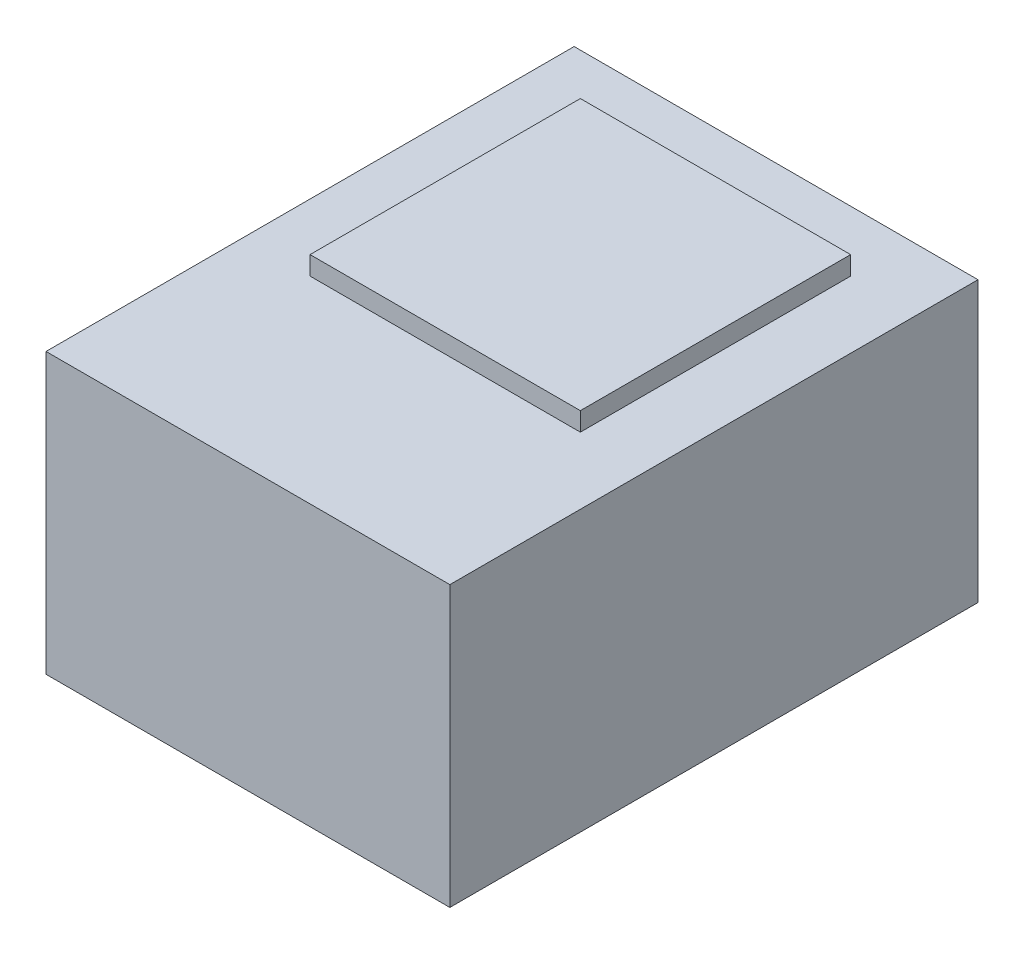
ISO-10303-21;
HEADER;
FILE_DESCRIPTION(('STEP AP214'),'2;1');
FILE_NAME('part.step','',(''),(''),'','','');
FILE_SCHEMA(('AUTOMOTIVE_DESIGN { 1 0 10303 214 1 1 1 1 }'));
ENDSEC;
DATA;
#1=APPLICATION_CONTEXT('core data for automotive mechanical design processes');
#2=APPLICATION_PROTOCOL_DEFINITION('international standard','automotive_design',2000,#1);
#3=PRODUCT_CONTEXT('',#1,'mechanical');
#4=PRODUCT('Part','Part','',(#3));
#5=PRODUCT_RELATED_PRODUCT_CATEGORY('part','',(#4));
#6=PRODUCT_DEFINITION_FORMATION('','',#4);
#7=PRODUCT_DEFINITION_CONTEXT('part definition',#1,'design');
#8=PRODUCT_DEFINITION('design','',#6,#7);
#9=PRODUCT_DEFINITION_SHAPE('','',#8);
#10=(LENGTH_UNIT() NAMED_UNIT(*) SI_UNIT(.MILLI.,.METRE.));
#11=(NAMED_UNIT(*) PLANE_ANGLE_UNIT() SI_UNIT($,.RADIAN.));
#12=(NAMED_UNIT(*) SI_UNIT($,.STERADIAN.) SOLID_ANGLE_UNIT());
#13=UNCERTAINTY_MEASURE_WITH_UNIT(LENGTH_MEASURE(1.E-05),#10,'distance_accuracy_value','');
#14=(GEOMETRIC_REPRESENTATION_CONTEXT(3) GLOBAL_UNCERTAINTY_ASSIGNED_CONTEXT((#13)) GLOBAL_UNIT_ASSIGNED_CONTEXT((#10,
#11,#12)) REPRESENTATION_CONTEXT('',''));
#15=CARTESIAN_POINT('',(0.,0.,0.));
#16=DIRECTION('',(0.,0.,1.));
#17=DIRECTION('',(1.,0.,0.));
#18=AXIS2_PLACEMENT_3D('',#15,#16,#17);
#19=CARTESIAN_POINT('',(0.,0.,0.));
#20=DIRECTION('',(0.,1.,0.));
#21=DIRECTION('',(0.,0.,1.));
#22=AXIS2_PLACEMENT_3D('',#19,#20,#21);
#23=PLANE('',#22);
#24=DIRECTION('',(0.,0.,1.));
#25=VECTOR('',#24,1.);
#26=CARTESIAN_POINT('',(-0.125,0.,0.786372602362917));
#27=LINE('',#26,#25);
#28=CARTESIAN_POINT('',(-0.124999999999999,0.,-0.713627397637083));
#29=VERTEX_POINT('',#28);
#30=CARTESIAN_POINT('',(-0.125,0.,0.786372602362917));
#31=VERTEX_POINT('',#30);
#32=EDGE_CURVE('E216',#29,#31,#27,.T.);
#33=ORIENTED_EDGE('',*,*,#32,.F.);
#34=DIRECTION('',(1.,0.,0.));
#35=VECTOR('',#34,1.);
#36=CARTESIAN_POINT('',(-0.524999999999999,0.,-0.713627397637083));
#37=LINE('',#36,#35);
#38=CARTESIAN_POINT('',(-0.524999999999999,0.,-0.713627397637083));
#39=VERTEX_POINT('',#38);
#40=EDGE_CURVE('E221',#39,#29,#37,.T.);
#41=ORIENTED_EDGE('',*,*,#40,.F.);
#42=DIRECTION('',(0.,0.,-1.));
#43=VECTOR('',#42,1.);
#44=CARTESIAN_POINT('',(-0.525,0.,0.786372602362917));
#45=LINE('',#44,#43);
#46=CARTESIAN_POINT('',(-0.525,0.,0.786372602362917));
#47=VERTEX_POINT('',#46);
#48=EDGE_CURVE('E233',#47,#39,#45,.T.);
#49=ORIENTED_EDGE('',*,*,#48,.F.);
#50=DIRECTION('',(-1.,0.,0.));
#51=VECTOR('',#50,1.);
#52=CARTESIAN_POINT('',(-0.525,0.,0.786372602362917));
#53=LINE('',#52,#51);
#54=EDGE_CURVE('E230',#31,#47,#53,.T.);
#55=ORIENTED_EDGE('',*,*,#54,.F.);
#56=EDGE_LOOP('',(#33,#41,#49,#55));
#57=FACE_BOUND('',#56,.T.);
#58=DIRECTION('',(0.,0.,-1.));
#59=VECTOR('',#58,1.);
#60=CARTESIAN_POINT('',(0.65,0.,-0.85));
#61=LINE('',#60,#59);
#62=CARTESIAN_POINT('',(0.65,0.,0.85));
#63=VERTEX_POINT('',#62);
#64=CARTESIAN_POINT('',(0.65,0.,-0.85));
#65=VERTEX_POINT('',#64);
#66=EDGE_CURVE('E249',#63,#65,#61,.T.);
#67=ORIENTED_EDGE('',*,*,#66,.F.);
#68=DIRECTION('',(1.,0.,0.));
#69=VECTOR('',#68,1.);
#70=CARTESIAN_POINT('',(-0.65,0.,0.85));
#71=LINE('',#70,#69);
#72=CARTESIAN_POINT('',(-0.65,0.,0.85));
#73=VERTEX_POINT('',#72);
#74=EDGE_CURVE('E254',#73,#63,#71,.T.);
#75=ORIENTED_EDGE('',*,*,#74,.F.);
#76=DIRECTION('',(0.,0.,1.));
#77=VECTOR('',#76,1.);
#78=CARTESIAN_POINT('',(-0.65,0.,-0.85));
#79=LINE('',#78,#77);
#80=CARTESIAN_POINT('',(-0.65,0.,-0.85));
#81=VERTEX_POINT('',#80);
#82=EDGE_CURVE('E265',#81,#73,#79,.T.);
#83=ORIENTED_EDGE('',*,*,#82,.F.);
#84=DIRECTION('',(-1.,0.,0.));
#85=VECTOR('',#84,1.);
#86=CARTESIAN_POINT('',(-0.65,0.,-0.85));
#87=LINE('',#86,#85);
#88=EDGE_CURVE('E263',#65,#81,#87,.T.);
#89=ORIENTED_EDGE('',*,*,#88,.F.);
#90=EDGE_LOOP('',(#67,#75,#83,#89));
#91=FACE_BOUND('',#90,.T.);
#92=DIRECTION('',(0.,0.,1.));
#93=VECTOR('',#92,1.);
#94=CARTESIAN_POINT('',(0.525,0.,0.786372602362917));
#95=LINE('',#94,#93);
#96=CARTESIAN_POINT('',(0.525,0.,-0.713627397637083));
#97=VERTEX_POINT('',#96);
#98=CARTESIAN_POINT('',(0.525,0.,0.786372602362917));
#99=VERTEX_POINT('',#98);
#100=EDGE_CURVE('E179',#97,#99,#95,.T.);
#101=ORIENTED_EDGE('',*,*,#100,.F.);
#102=DIRECTION('',(1.,0.,0.));
#103=VECTOR('',#102,1.);
#104=CARTESIAN_POINT('',(0.125000000000001,0.,-0.713627397637083));
#105=LINE('',#104,#103);
#106=CARTESIAN_POINT('',(0.125000000000001,0.,-0.713627397637083));
#107=VERTEX_POINT('',#106);
#108=EDGE_CURVE('E188',#107,#97,#105,.T.);
#109=ORIENTED_EDGE('',*,*,#108,.F.);
#110=DIRECTION('',(0.,0.,-1.));
#111=VECTOR('',#110,1.);
#112=CARTESIAN_POINT('',(0.125,0.,0.786372602362917));
#113=LINE('',#112,#111);
#114=CARTESIAN_POINT('',(0.125,0.,0.786372602362917));
#115=VERTEX_POINT('',#114);
#116=EDGE_CURVE('E200',#115,#107,#113,.T.);
#117=ORIENTED_EDGE('',*,*,#116,.F.);
#118=DIRECTION('',(-1.,0.,0.));
#119=VECTOR('',#118,1.);
#120=CARTESIAN_POINT('',(0.125,0.,0.786372602362917));
#121=LINE('',#120,#119);
#122=EDGE_CURVE('E197',#99,#115,#121,.T.);
#123=ORIENTED_EDGE('',*,*,#122,.F.);
#124=EDGE_LOOP('',(#101,#109,#117,#123));
#125=FACE_BOUND('',#124,.T.);
#126=ADVANCED_FACE('F34',(#57,#91,#125),#23,.F.);
#127=CARTESIAN_POINT('',(0.65,0.9,-0.85));
#128=DIRECTION('',(-1.,0.,0.));
#129=DIRECTION('',(0.,0.,1.));
#130=AXIS2_PLACEMENT_3D('',#127,#128,#129);
#131=PLANE('',#130);
#132=ORIENTED_EDGE('',*,*,#66,.T.);
#133=DIRECTION('',(0.,-1.,0.));
#134=VECTOR('',#133,1.);
#135=CARTESIAN_POINT('',(0.65,0.9,-0.85));
#136=LINE('',#135,#134);
#137=CARTESIAN_POINT('',(0.65,0.9,-0.85));
#138=VERTEX_POINT('',#137);
#139=EDGE_CURVE('E11',#138,#65,#136,.T.);
#140=ORIENTED_EDGE('',*,*,#139,.F.);
#141=DIRECTION('',(0.,0.,-1.));
#142=VECTOR('',#141,1.);
#143=CARTESIAN_POINT('',(0.65,0.9,-0.85));
#144=LINE('',#143,#142);
#145=CARTESIAN_POINT('',(0.65,0.9,0.85));
#146=VERTEX_POINT('',#145);
#147=EDGE_CURVE('E250',#146,#138,#144,.T.);
#148=ORIENTED_EDGE('',*,*,#147,.F.);
#149=DIRECTION('',(0.,-1.,0.));
#150=VECTOR('',#149,1.);
#151=CARTESIAN_POINT('',(0.65,0.9,0.85));
#152=LINE('',#151,#150);
#153=EDGE_CURVE('E260',#146,#63,#152,.T.);
#154=ORIENTED_EDGE('',*,*,#153,.T.);
#155=EDGE_LOOP('',(#132,#140,#148,#154));
#156=FACE_BOUND('',#155,.T.);
#157=ADVANCED_FACE('F36',(#156),#131,.F.);
#158=CARTESIAN_POINT('',(-0.65,0.9,-0.85));
#159=DIRECTION('',(0.,0.,1.));
#160=DIRECTION('',(1.,0.,0.));
#161=AXIS2_PLACEMENT_3D('',#158,#159,#160);
#162=PLANE('',#161);
#163=ORIENTED_EDGE('',*,*,#88,.T.);
#164=DIRECTION('',(0.,-1.,0.));
#165=VECTOR('',#164,1.);
#166=CARTESIAN_POINT('',(-0.65,0.9,-0.85));
#167=LINE('',#166,#165);
#168=CARTESIAN_POINT('',(-0.65,0.9,-0.85));
#169=VERTEX_POINT('',#168);
#170=EDGE_CURVE('E42',#169,#81,#167,.T.);
#171=ORIENTED_EDGE('',*,*,#170,.F.);
#172=DIRECTION('',(-1.,0.,0.));
#173=VECTOR('',#172,1.);
#174=CARTESIAN_POINT('',(-0.65,0.9,-0.85));
#175=LINE('',#174,#173);
#176=EDGE_CURVE('E253',#138,#169,#175,.T.);
#177=ORIENTED_EDGE('',*,*,#176,.F.);
#178=ORIENTED_EDGE('',*,*,#139,.T.);
#179=EDGE_LOOP('',(#163,#171,#177,#178));
#180=FACE_BOUND('',#179,.T.);
#181=ADVANCED_FACE('F293',(#180),#162,.F.);
#182=CARTESIAN_POINT('',(-0.65,0.9,-0.85));
#183=DIRECTION('',(1.,0.,0.));
#184=DIRECTION('',(0.,0.,-1.));
#185=AXIS2_PLACEMENT_3D('',#182,#183,#184);
#186=PLANE('',#185);
#187=ORIENTED_EDGE('',*,*,#82,.T.);
#188=DIRECTION('',(0.,-1.,0.));
#189=VECTOR('',#188,1.);
#190=CARTESIAN_POINT('',(-0.65,0.9,0.85));
#191=LINE('',#190,#189);
#192=CARTESIAN_POINT('',(-0.65,0.9,0.85));
#193=VERTEX_POINT('',#192);
#194=EDGE_CURVE('E270',#193,#73,#191,.T.);
#195=ORIENTED_EDGE('',*,*,#194,.F.);
#196=DIRECTION('',(0.,0.,1.));
#197=VECTOR('',#196,1.);
#198=CARTESIAN_POINT('',(-0.65,0.9,-0.85));
#199=LINE('',#198,#197);
#200=EDGE_CURVE('E256',#169,#193,#199,.T.);
#201=ORIENTED_EDGE('',*,*,#200,.F.);
#202=ORIENTED_EDGE('',*,*,#170,.T.);
#203=EDGE_LOOP('',(#187,#195,#201,#202));
#204=FACE_BOUND('',#203,.T.);
#205=ADVANCED_FACE('F277',(#204),#186,.F.);
#206=CARTESIAN_POINT('',(-0.65,0.9,0.85));
#207=DIRECTION('',(0.,0.,-1.));
#208=DIRECTION('',(-1.,0.,0.));
#209=AXIS2_PLACEMENT_3D('',#206,#207,#208);
#210=PLANE('',#209);
#211=ORIENTED_EDGE('',*,*,#74,.T.);
#212=ORIENTED_EDGE('',*,*,#153,.F.);
#213=DIRECTION('',(1.,0.,0.));
#214=VECTOR('',#213,1.);
#215=CARTESIAN_POINT('',(-0.65,0.9,0.85));
#216=LINE('',#215,#214);
#217=EDGE_CURVE('E258',#193,#146,#216,.T.);
#218=ORIENTED_EDGE('',*,*,#217,.F.);
#219=ORIENTED_EDGE('',*,*,#194,.T.);
#220=EDGE_LOOP('',(#211,#212,#218,#219));
#221=FACE_BOUND('',#220,.T.);
#222=ADVANCED_FACE('F286',(#221),#210,.F.);
#223=CARTESIAN_POINT('',(0.,0.9,0.));
#224=DIRECTION('',(0.,1.,0.));
#225=DIRECTION('',(0.,0.,1.));
#226=AXIS2_PLACEMENT_3D('',#223,#224,#225);
#227=PLANE('',#226);
#228=DIRECTION('',(1.,0.,0.));
#229=VECTOR('',#228,1.);
#230=CARTESIAN_POINT('',(-0.435,0.9,-0.655));
#231=LINE('',#230,#229);
#232=CARTESIAN_POINT('',(-0.435,0.9,-0.655));
#233=VERTEX_POINT('',#232);
#234=CARTESIAN_POINT('',(0.435,0.9,-0.655));
#235=VERTEX_POINT('',#234);
#236=EDGE_CURVE('E174',#233,#235,#231,.T.);
#237=ORIENTED_EDGE('',*,*,#236,.T.);
#238=DIRECTION('',(0.,0.,1.));
#239=VECTOR('',#238,1.);
#240=CARTESIAN_POINT('',(0.435,0.9,-0.655));
#241=LINE('',#240,#239);
#242=CARTESIAN_POINT('',(0.435,0.9,0.215));
#243=VERTEX_POINT('',#242);
#244=EDGE_CURVE('E151',#235,#243,#241,.T.);
#245=ORIENTED_EDGE('',*,*,#244,.T.);
#246=DIRECTION('',(1.,0.,0.));
#247=VECTOR('',#246,1.);
#248=CARTESIAN_POINT('',(-0.435,0.9,0.215));
#249=LINE('',#248,#247);
#250=CARTESIAN_POINT('',(-0.435,0.9,0.215));
#251=VERTEX_POINT('',#250);
#252=EDGE_CURVE('E54',#251,#243,#249,.T.);
#253=ORIENTED_EDGE('',*,*,#252,.F.);
#254=DIRECTION('',(0.,0.,1.));
#255=VECTOR('',#254,1.);
#256=CARTESIAN_POINT('',(-0.435,0.9,-0.655));
#257=LINE('',#256,#255);
#258=EDGE_CURVE('E49',#233,#251,#257,.T.);
#259=ORIENTED_EDGE('',*,*,#258,.F.);
#260=EDGE_LOOP('',(#237,#245,#253,#259));
#261=FACE_BOUND('',#260,.T.);
#262=ORIENTED_EDGE('',*,*,#147,.T.);
#263=ORIENTED_EDGE('',*,*,#176,.T.);
#264=ORIENTED_EDGE('',*,*,#200,.T.);
#265=ORIENTED_EDGE('',*,*,#217,.T.);
#266=EDGE_LOOP('',(#262,#263,#264,#265));
#267=FACE_BOUND('',#266,.T.);
#268=ADVANCED_FACE('F292',(#261,#267),#227,.T.);
#269=CARTESIAN_POINT('',(-0.125,-0.06,0.786372602362917));
#270=DIRECTION('',(-1.,0.,0.));
#271=DIRECTION('',(0.,0.,1.));
#272=AXIS2_PLACEMENT_3D('',#269,#270,#271);
#273=PLANE('',#272);
#274=ORIENTED_EDGE('',*,*,#32,.T.);
#275=DIRECTION('',(0.,1.,0.));
#276=VECTOR('',#275,1.);
#277=CARTESIAN_POINT('',(-0.125,-0.06,0.786372602362917));
#278=LINE('',#277,#276);
#279=CARTESIAN_POINT('',(-0.125,-0.06,0.786372602362917));
#280=VERTEX_POINT('',#279);
#281=EDGE_CURVE('E246',#280,#31,#278,.T.);
#282=ORIENTED_EDGE('',*,*,#281,.F.);
#283=DIRECTION('',(0.,0.,1.));
#284=VECTOR('',#283,1.);
#285=CARTESIAN_POINT('',(-0.125,-0.06,0.786372602362917));
#286=LINE('',#285,#284);
#287=CARTESIAN_POINT('',(-0.124999999999999,-0.06,-0.713627397637083));
#288=VERTEX_POINT('',#287);
#289=EDGE_CURVE('E217',#288,#280,#286,.T.);
#290=ORIENTED_EDGE('',*,*,#289,.F.);
#291=DIRECTION('',(0.,1.,0.));
#292=VECTOR('',#291,1.);
#293=CARTESIAN_POINT('',(-0.124999999999999,-0.06,-0.713627397637083));
#294=LINE('',#293,#292);
#295=EDGE_CURVE('E227',#288,#29,#294,.T.);
#296=ORIENTED_EDGE('',*,*,#295,.T.);
#297=EDGE_LOOP('',(#274,#282,#290,#296));
#298=FACE_BOUND('',#297,.T.);
#299=ADVANCED_FACE('F312',(#298),#273,.F.);
#300=CARTESIAN_POINT('',(-0.525,-0.06,0.786372602362917));
#301=DIRECTION('',(0.,0.,-1.));
#302=DIRECTION('',(-1.,0.,0.));
#303=AXIS2_PLACEMENT_3D('',#300,#301,#302);
#304=PLANE('',#303);
#305=ORIENTED_EDGE('',*,*,#54,.T.);
#306=DIRECTION('',(0.,1.,0.));
#307=VECTOR('',#306,1.);
#308=CARTESIAN_POINT('',(-0.525,-0.06,0.786372602362917));
#309=LINE('',#308,#307);
#310=CARTESIAN_POINT('',(-0.525,-0.06,0.786372602362917));
#311=VERTEX_POINT('',#310);
#312=EDGE_CURVE('E243',#311,#47,#309,.T.);
#313=ORIENTED_EDGE('',*,*,#312,.F.);
#314=DIRECTION('',(-1.,0.,0.));
#315=VECTOR('',#314,1.);
#316=CARTESIAN_POINT('',(-0.525,-0.06,0.786372602362917));
#317=LINE('',#316,#315);
#318=EDGE_CURVE('E220',#280,#311,#317,.T.);
#319=ORIENTED_EDGE('',*,*,#318,.F.);
#320=ORIENTED_EDGE('',*,*,#281,.T.);
#321=EDGE_LOOP('',(#305,#313,#319,#320));
#322=FACE_BOUND('',#321,.T.);
#323=ADVANCED_FACE('F316',(#322),#304,.F.);
#324=CARTESIAN_POINT('',(-0.525,-0.06,0.786372602362917));
#325=DIRECTION('',(1.,0.,0.));
#326=DIRECTION('',(0.,0.,-1.));
#327=AXIS2_PLACEMENT_3D('',#324,#325,#326);
#328=PLANE('',#327);
#329=ORIENTED_EDGE('',*,*,#48,.T.);
#330=DIRECTION('',(0.,1.,0.));
#331=VECTOR('',#330,1.);
#332=CARTESIAN_POINT('',(-0.524999999999999,-0.06,-0.713627397637083));
#333=LINE('',#332,#331);
#334=CARTESIAN_POINT('',(-0.524999999999999,-0.06,-0.713627397637083));
#335=VERTEX_POINT('',#334);
#336=EDGE_CURVE('E240',#335,#39,#333,.T.);
#337=ORIENTED_EDGE('',*,*,#336,.F.);
#338=DIRECTION('',(0.,0.,-1.));
#339=VECTOR('',#338,1.);
#340=CARTESIAN_POINT('',(-0.525,-0.06,0.786372602362917));
#341=LINE('',#340,#339);
#342=EDGE_CURVE('E223',#311,#335,#341,.T.);
#343=ORIENTED_EDGE('',*,*,#342,.F.);
#344=ORIENTED_EDGE('',*,*,#312,.T.);
#345=EDGE_LOOP('',(#329,#337,#343,#344));
#346=FACE_BOUND('',#345,.T.);
#347=ADVANCED_FACE('F362',(#346),#328,.F.);
#348=CARTESIAN_POINT('',(-0.524999999999999,-0.06,-0.713627397637083));
#349=DIRECTION('',(0.,0.,1.));
#350=DIRECTION('',(1.,0.,0.));
#351=AXIS2_PLACEMENT_3D('',#348,#349,#350);
#352=PLANE('',#351);
#353=ORIENTED_EDGE('',*,*,#40,.T.);
#354=ORIENTED_EDGE('',*,*,#295,.F.);
#355=DIRECTION('',(1.,0.,0.));
#356=VECTOR('',#355,1.);
#357=CARTESIAN_POINT('',(-0.524999999999999,-0.06,-0.713627397637083));
#358=LINE('',#357,#356);
#359=EDGE_CURVE('E225',#335,#288,#358,.T.);
#360=ORIENTED_EDGE('',*,*,#359,.F.);
#361=ORIENTED_EDGE('',*,*,#336,.T.);
#362=EDGE_LOOP('',(#353,#354,#360,#361));
#363=FACE_BOUND('',#362,.T.);
#364=ADVANCED_FACE('F358',(#363),#352,.F.);
#365=CARTESIAN_POINT('',(0.,-0.06,0.));
#366=DIRECTION('',(0.,-1.,0.));
#367=DIRECTION('',(0.,0.,-1.));
#368=AXIS2_PLACEMENT_3D('',#365,#366,#367);
#369=PLANE('',#368);
#370=ORIENTED_EDGE('',*,*,#289,.T.);
#371=ORIENTED_EDGE('',*,*,#318,.T.);
#372=ORIENTED_EDGE('',*,*,#342,.T.);
#373=ORIENTED_EDGE('',*,*,#359,.T.);
#374=EDGE_LOOP('',(#370,#371,#372,#373));
#375=FACE_BOUND('',#374,.T.);
#376=ADVANCED_FACE('F354',(#375),#369,.T.);
#377=CARTESIAN_POINT('',(0.525,-0.06,0.786372602362917));
#378=DIRECTION('',(-1.,0.,0.));
#379=DIRECTION('',(0.,0.,1.));
#380=AXIS2_PLACEMENT_3D('',#377,#378,#379);
#381=PLANE('',#380);
#382=ORIENTED_EDGE('',*,*,#100,.T.);
#383=DIRECTION('',(0.,1.,0.));
#384=VECTOR('',#383,1.);
#385=CARTESIAN_POINT('',(0.525,-0.06,0.786372602362917));
#386=LINE('',#385,#384);
#387=CARTESIAN_POINT('',(0.525,-0.06,0.786372602362917));
#388=VERTEX_POINT('',#387);
#389=EDGE_CURVE('E213',#388,#99,#386,.T.);
#390=ORIENTED_EDGE('',*,*,#389,.F.);
#391=DIRECTION('',(0.,0.,1.));
#392=VECTOR('',#391,1.);
#393=CARTESIAN_POINT('',(0.525,-0.06,0.786372602362917));
#394=LINE('',#393,#392);
#395=CARTESIAN_POINT('',(0.525,-0.06,-0.713627397637083));
#396=VERTEX_POINT('',#395);
#397=EDGE_CURVE('E184',#396,#388,#394,.T.);
#398=ORIENTED_EDGE('',*,*,#397,.F.);
#399=DIRECTION('',(0.,1.,0.));
#400=VECTOR('',#399,1.);
#401=CARTESIAN_POINT('',(0.525,-0.06,-0.713627397637083));
#402=LINE('',#401,#400);
#403=EDGE_CURVE('E194',#396,#97,#402,.T.);
#404=ORIENTED_EDGE('',*,*,#403,.T.);
#405=EDGE_LOOP('',(#382,#390,#398,#404));
#406=FACE_BOUND('',#405,.T.);
#407=ADVANCED_FACE('F350',(#406),#381,.F.);
#408=CARTESIAN_POINT('',(0.125,-0.06,0.786372602362917));
#409=DIRECTION('',(0.,0.,-1.));
#410=DIRECTION('',(-1.,0.,0.));
#411=AXIS2_PLACEMENT_3D('',#408,#409,#410);
#412=PLANE('',#411);
#413=ORIENTED_EDGE('',*,*,#122,.T.);
#414=DIRECTION('',(0.,1.,0.));
#415=VECTOR('',#414,1.);
#416=CARTESIAN_POINT('',(0.125,-0.06,0.786372602362917));
#417=LINE('',#416,#415);
#418=CARTESIAN_POINT('',(0.125,-0.06,0.786372602362917));
#419=VERTEX_POINT('',#418);
#420=EDGE_CURVE('E210',#419,#115,#417,.T.);
#421=ORIENTED_EDGE('',*,*,#420,.F.);
#422=DIRECTION('',(-1.,0.,0.));
#423=VECTOR('',#422,1.);
#424=CARTESIAN_POINT('',(0.125,-0.06,0.786372602362917));
#425=LINE('',#424,#423);
#426=EDGE_CURVE('E187',#388,#419,#425,.T.);
#427=ORIENTED_EDGE('',*,*,#426,.F.);
#428=ORIENTED_EDGE('',*,*,#389,.T.);
#429=EDGE_LOOP('',(#413,#421,#427,#428));
#430=FACE_BOUND('',#429,.T.);
#431=ADVANCED_FACE('F346',(#430),#412,.F.);
#432=CARTESIAN_POINT('',(0.125,-0.06,0.786372602362917));
#433=DIRECTION('',(1.,0.,0.));
#434=DIRECTION('',(0.,0.,-1.));
#435=AXIS2_PLACEMENT_3D('',#432,#433,#434);
#436=PLANE('',#435);
#437=ORIENTED_EDGE('',*,*,#116,.T.);
#438=DIRECTION('',(0.,1.,0.));
#439=VECTOR('',#438,1.);
#440=CARTESIAN_POINT('',(0.125000000000001,-0.06,-0.713627397637083));
#441=LINE('',#440,#439);
#442=CARTESIAN_POINT('',(0.125000000000001,-0.06,-0.713627397637083));
#443=VERTEX_POINT('',#442);
#444=EDGE_CURVE('E207',#443,#107,#441,.T.);
#445=ORIENTED_EDGE('',*,*,#444,.F.);
#446=DIRECTION('',(0.,0.,-1.));
#447=VECTOR('',#446,1.);
#448=CARTESIAN_POINT('',(0.125,-0.06,0.786372602362917));
#449=LINE('',#448,#447);
#450=EDGE_CURVE('E190',#419,#443,#449,.T.);
#451=ORIENTED_EDGE('',*,*,#450,.F.);
#452=ORIENTED_EDGE('',*,*,#420,.T.);
#453=EDGE_LOOP('',(#437,#445,#451,#452));
#454=FACE_BOUND('',#453,.T.);
#455=ADVANCED_FACE('F342',(#454),#436,.F.);
#456=CARTESIAN_POINT('',(0.125000000000001,-0.06,-0.713627397637083));
#457=DIRECTION('',(0.,0.,1.));
#458=DIRECTION('',(1.,0.,0.));
#459=AXIS2_PLACEMENT_3D('',#456,#457,#458);
#460=PLANE('',#459);
#461=ORIENTED_EDGE('',*,*,#108,.T.);
#462=ORIENTED_EDGE('',*,*,#403,.F.);
#463=DIRECTION('',(1.,0.,0.));
#464=VECTOR('',#463,1.);
#465=CARTESIAN_POINT('',(0.125000000000001,-0.06,-0.713627397637083));
#466=LINE('',#465,#464);
#467=EDGE_CURVE('E192',#443,#396,#466,.T.);
#468=ORIENTED_EDGE('',*,*,#467,.F.);
#469=ORIENTED_EDGE('',*,*,#444,.T.);
#470=EDGE_LOOP('',(#461,#462,#468,#469));
#471=FACE_BOUND('',#470,.T.);
#472=ADVANCED_FACE('F338',(#471),#460,.F.);
#473=CARTESIAN_POINT('',(0.,-0.06,0.));
#474=DIRECTION('',(0.,-1.,0.));
#475=DIRECTION('',(0.,0.,-1.));
#476=AXIS2_PLACEMENT_3D('',#473,#474,#475);
#477=PLANE('',#476);
#478=ORIENTED_EDGE('',*,*,#397,.T.);
#479=ORIENTED_EDGE('',*,*,#426,.T.);
#480=ORIENTED_EDGE('',*,*,#450,.T.);
#481=ORIENTED_EDGE('',*,*,#467,.T.);
#482=EDGE_LOOP('',(#478,#479,#480,#481));
#483=FACE_BOUND('',#482,.T.);
#484=ADVANCED_FACE('F330',(#483),#477,.T.);
#485=CARTESIAN_POINT('',(-0.435,0.96,-0.655));
#486=DIRECTION('',(0.,0.,-1.));
#487=DIRECTION('',(-1.,0.,0.));
#488=AXIS2_PLACEMENT_3D('',#485,#486,#487);
#489=PLANE('',#488);
#490=ORIENTED_EDGE('',*,*,#236,.F.);
#491=DIRECTION('',(0.,-1.,0.));
#492=VECTOR('',#491,1.);
#493=CARTESIAN_POINT('',(-0.435,0.96,-0.655));
#494=LINE('',#493,#492);
#495=CARTESIAN_POINT('',(-0.435,0.96,-0.655));
#496=VERTEX_POINT('',#495);
#497=EDGE_CURVE('E167',#496,#233,#494,.T.);
#498=ORIENTED_EDGE('',*,*,#497,.F.);
#499=DIRECTION('',(1.,0.,0.));
#500=VECTOR('',#499,1.);
#501=CARTESIAN_POINT('',(-0.435,0.96,-0.655));
#502=LINE('',#501,#500);
#503=CARTESIAN_POINT('',(0.435,0.96,-0.655));
#504=VERTEX_POINT('',#503);
#505=EDGE_CURVE('E161',#496,#504,#502,.T.);
#506=ORIENTED_EDGE('',*,*,#505,.T.);
#507=DIRECTION('',(0.,-1.,0.));
#508=VECTOR('',#507,1.);
#509=CARTESIAN_POINT('',(0.435,0.96,-0.655));
#510=LINE('',#509,#508);
#511=EDGE_CURVE('E146',#504,#235,#510,.T.);
#512=ORIENTED_EDGE('',*,*,#511,.T.);
#513=EDGE_LOOP('',(#490,#498,#506,#512));
#514=FACE_BOUND('',#513,.T.);
#515=ADVANCED_FACE('F166',(#514),#489,.T.);
#516=CARTESIAN_POINT('',(-0.435,0.96,-0.655));
#517=DIRECTION('',(1.,0.,0.));
#518=DIRECTION('',(0.,0.,-1.));
#519=AXIS2_PLACEMENT_3D('',#516,#517,#518);
#520=PLANE('',#519);
#521=ORIENTED_EDGE('',*,*,#258,.T.);
#522=DIRECTION('',(0.,-1.,0.));
#523=VECTOR('',#522,1.);
#524=CARTESIAN_POINT('',(-0.435,0.96,0.215));
#525=LINE('',#524,#523);
#526=CARTESIAN_POINT('',(-0.435,0.96,0.215));
#527=VERTEX_POINT('',#526);
#528=EDGE_CURVE('E180',#527,#251,#525,.T.);
#529=ORIENTED_EDGE('',*,*,#528,.F.);
#530=DIRECTION('',(0.,0.,1.));
#531=VECTOR('',#530,1.);
#532=CARTESIAN_POINT('',(-0.435,0.96,-0.655));
#533=LINE('',#532,#531);
#534=EDGE_CURVE('E156',#496,#527,#533,.T.);
#535=ORIENTED_EDGE('',*,*,#534,.F.);
#536=ORIENTED_EDGE('',*,*,#497,.T.);
#537=EDGE_LOOP('',(#521,#529,#535,#536));
#538=FACE_BOUND('',#537,.T.);
#539=ADVANCED_FACE('F322',(#538),#520,.F.);
#540=CARTESIAN_POINT('',(-0.435,0.96,0.215));
#541=DIRECTION('',(0.,0.,-1.));
#542=DIRECTION('',(-1.,0.,0.));
#543=AXIS2_PLACEMENT_3D('',#540,#541,#542);
#544=PLANE('',#543);
#545=ORIENTED_EDGE('',*,*,#252,.T.);
#546=DIRECTION('',(0.,-1.,0.));
#547=VECTOR('',#546,1.);
#548=CARTESIAN_POINT('',(0.435,0.96,0.215));
#549=LINE('',#548,#547);
#550=CARTESIAN_POINT('',(0.435,0.96,0.215));
#551=VERTEX_POINT('',#550);
#552=EDGE_CURVE('E155',#551,#243,#549,.T.);
#553=ORIENTED_EDGE('',*,*,#552,.F.);
#554=DIRECTION('',(1.,0.,0.));
#555=VECTOR('',#554,1.);
#556=CARTESIAN_POINT('',(-0.435,0.96,0.215));
#557=LINE('',#556,#555);
#558=EDGE_CURVE('E163',#527,#551,#557,.T.);
#559=ORIENTED_EDGE('',*,*,#558,.F.);
#560=ORIENTED_EDGE('',*,*,#528,.T.);
#561=EDGE_LOOP('',(#545,#553,#559,#560));
#562=FACE_BOUND('',#561,.T.);
#563=ADVANCED_FACE('F319',(#562),#544,.F.);
#564=CARTESIAN_POINT('',(0.435,0.96,-0.655));
#565=DIRECTION('',(1.,0.,0.));
#566=DIRECTION('',(0.,0.,-1.));
#567=AXIS2_PLACEMENT_3D('',#564,#565,#566);
#568=PLANE('',#567);
#569=ORIENTED_EDGE('',*,*,#244,.F.);
#570=ORIENTED_EDGE('',*,*,#511,.F.);
#571=DIRECTION('',(0.,0.,1.));
#572=VECTOR('',#571,1.);
#573=CARTESIAN_POINT('',(0.435,0.96,-0.655));
#574=LINE('',#573,#572);
#575=EDGE_CURVE('E150',#504,#551,#574,.T.);
#576=ORIENTED_EDGE('',*,*,#575,.T.);
#577=ORIENTED_EDGE('',*,*,#552,.T.);
#578=EDGE_LOOP('',(#569,#570,#576,#577));
#579=FACE_BOUND('',#578,.T.);
#580=ADVANCED_FACE('F148',(#579),#568,.T.);
#581=CARTESIAN_POINT('',(0.,0.96,0.));
#582=DIRECTION('',(0.,-1.,0.));
#583=DIRECTION('',(0.,0.,-1.));
#584=AXIS2_PLACEMENT_3D('',#581,#582,#583);
#585=PLANE('',#584);
#586=ORIENTED_EDGE('',*,*,#505,.F.);
#587=ORIENTED_EDGE('',*,*,#534,.T.);
#588=ORIENTED_EDGE('',*,*,#558,.T.);
#589=ORIENTED_EDGE('',*,*,#575,.F.);
#590=EDGE_LOOP('',(#586,#587,#588,#589));
#591=FACE_BOUND('',#590,.T.);
#592=ADVANCED_FACE('F160',(#591),#585,.F.);
#593=CLOSED_SHELL('',(#126,#157,#181,#205,#222,#268,#299,#323,#347,#364,#376,#407,#431,#455,
#472,#484,#515,#539,#563,#580,#592));
#594=MANIFOLD_SOLID_BREP('B2',#593);
#595=ADVANCED_BREP_SHAPE_REPRESENTATION('',(#18,#594),#14);
#596=SHAPE_DEFINITION_REPRESENTATION(#9,#595);
ENDSEC;
END-ISO-10303-21;
